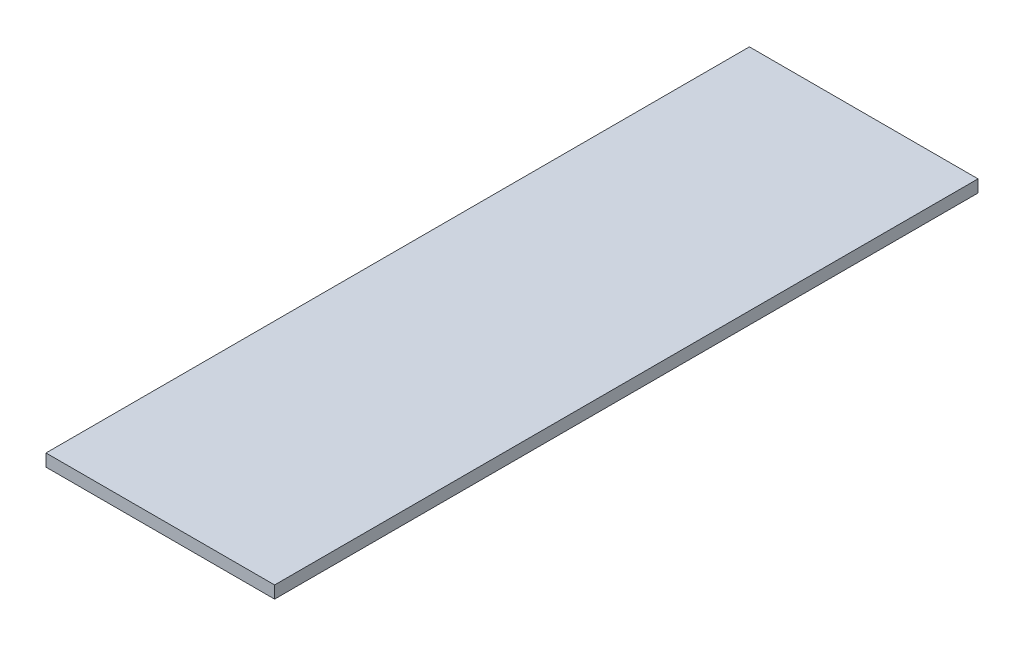
ISO-10303-21;
HEADER;
FILE_DESCRIPTION(('STEP AP214'),'2;1');
FILE_NAME('part.step','',(''),(''),'','','');
FILE_SCHEMA(('AUTOMOTIVE_DESIGN { 1 0 10303 214 1 1 1 1 }'));
ENDSEC;
DATA;
#1=APPLICATION_CONTEXT('core data for automotive mechanical design processes');
#2=APPLICATION_PROTOCOL_DEFINITION('international standard','automotive_design',2000,#1);
#3=PRODUCT_CONTEXT('',#1,'mechanical');
#4=PRODUCT('Part','Part','',(#3));
#5=PRODUCT_RELATED_PRODUCT_CATEGORY('part','',(#4));
#6=PRODUCT_DEFINITION_FORMATION('','',#4);
#7=PRODUCT_DEFINITION_CONTEXT('part definition',#1,'design');
#8=PRODUCT_DEFINITION('design','',#6,#7);
#9=PRODUCT_DEFINITION_SHAPE('','',#8);
#10=(LENGTH_UNIT() NAMED_UNIT(*) SI_UNIT(.MILLI.,.METRE.));
#11=(NAMED_UNIT(*) PLANE_ANGLE_UNIT() SI_UNIT($,.RADIAN.));
#12=(NAMED_UNIT(*) SI_UNIT($,.STERADIAN.) SOLID_ANGLE_UNIT());
#13=UNCERTAINTY_MEASURE_WITH_UNIT(LENGTH_MEASURE(1.E-05),#10,'distance_accuracy_value','');
#14=(GEOMETRIC_REPRESENTATION_CONTEXT(3) GLOBAL_UNCERTAINTY_ASSIGNED_CONTEXT((#13)) GLOBAL_UNIT_ASSIGNED_CONTEXT((#10,
#11,#12)) REPRESENTATION_CONTEXT('',''));
#15=CARTESIAN_POINT('',(0.,0.,0.));
#16=DIRECTION('',(0.,0.,1.));
#17=DIRECTION('',(1.,0.,0.));
#18=AXIS2_PLACEMENT_3D('',#15,#16,#17);
#19=CARTESIAN_POINT('',(6.50000000000001,0.7,20.));
#20=DIRECTION('',(-1.,0.,0.));
#21=DIRECTION('',(0.,0.,1.));
#22=AXIS2_PLACEMENT_3D('',#19,#20,#21);
#23=PLANE('',#22);
#24=DIRECTION('',(0.,0.,-1.));
#25=VECTOR('',#24,1.);
#26=CARTESIAN_POINT('',(6.50000000000001,0.,20.));
#27=LINE('',#26,#25);
#28=CARTESIAN_POINT('',(6.50000000000001,0.,20.));
#29=VERTEX_POINT('',#28);
#30=CARTESIAN_POINT('',(6.50000000000001,0.,-20.));
#31=VERTEX_POINT('',#30);
#32=EDGE_CURVE('E95',#29,#31,#27,.T.);
#33=ORIENTED_EDGE('',*,*,#32,.T.);
#34=DIRECTION('',(0.,-1.,0.));
#35=VECTOR('',#34,1.);
#36=CARTESIAN_POINT('',(6.50000000000001,0.7,-20.));
#37=LINE('',#36,#35);
#38=CARTESIAN_POINT('',(6.50000000000001,0.7,-20.));
#39=VERTEX_POINT('',#38);
#40=EDGE_CURVE('E11',#39,#31,#37,.T.);
#41=ORIENTED_EDGE('',*,*,#40,.F.);
#42=DIRECTION('',(0.,0.,-1.));
#43=VECTOR('',#42,1.);
#44=CARTESIAN_POINT('',(6.50000000000001,0.7,20.));
#45=LINE('',#44,#43);
#46=CARTESIAN_POINT('',(6.50000000000001,0.7,20.));
#47=VERTEX_POINT('',#46);
#48=EDGE_CURVE('E83',#47,#39,#45,.T.);
#49=ORIENTED_EDGE('',*,*,#48,.F.);
#50=DIRECTION('',(0.,-1.,0.));
#51=VECTOR('',#50,1.);
#52=CARTESIAN_POINT('',(6.50000000000001,0.7,20.));
#53=LINE('',#52,#51);
#54=EDGE_CURVE('E91',#47,#29,#53,.T.);
#55=ORIENTED_EDGE('',*,*,#54,.T.);
#56=EDGE_LOOP('',(#33,#41,#49,#55));
#57=FACE_BOUND('',#56,.T.);
#58=ADVANCED_FACE('F32',(#57),#23,.F.);
#59=CARTESIAN_POINT('',(-6.49999999999998,0.7,-20.));
#60=DIRECTION('',(0.,0.,1.));
#61=DIRECTION('',(1.,0.,0.));
#62=AXIS2_PLACEMENT_3D('',#59,#60,#61);
#63=PLANE('',#62);
#64=DIRECTION('',(-1.,0.,0.));
#65=VECTOR('',#64,1.);
#66=CARTESIAN_POINT('',(-6.49999999999998,0.,-20.));
#67=LINE('',#66,#65);
#68=CARTESIAN_POINT('',(-6.49999999999998,0.,-20.));
#69=VERTEX_POINT('',#68);
#70=EDGE_CURVE('E87',#31,#69,#67,.T.);
#71=ORIENTED_EDGE('',*,*,#70,.T.);
#72=DIRECTION('',(0.,-1.,0.));
#73=VECTOR('',#72,1.);
#74=CARTESIAN_POINT('',(-6.49999999999998,0.7,-20.));
#75=LINE('',#74,#73);
#76=CARTESIAN_POINT('',(-6.49999999999998,0.7,-20.));
#77=VERTEX_POINT('',#76);
#78=EDGE_CURVE('E40',#77,#69,#75,.T.);
#79=ORIENTED_EDGE('',*,*,#78,.F.);
#80=DIRECTION('',(-1.,0.,0.));
#81=VECTOR('',#80,1.);
#82=CARTESIAN_POINT('',(-6.49999999999998,0.7,-20.));
#83=LINE('',#82,#81);
#84=EDGE_CURVE('E78',#39,#77,#83,.T.);
#85=ORIENTED_EDGE('',*,*,#84,.F.);
#86=ORIENTED_EDGE('',*,*,#40,.T.);
#87=EDGE_LOOP('',(#71,#79,#85,#86));
#88=FACE_BOUND('',#87,.T.);
#89=ADVANCED_FACE('F86',(#88),#63,.F.);
#90=CARTESIAN_POINT('',(-6.49999999999998,0.7,20.));
#91=DIRECTION('',(1.,0.,0.));
#92=DIRECTION('',(0.,0.,-1.));
#93=AXIS2_PLACEMENT_3D('',#90,#91,#92);
#94=PLANE('',#93);
#95=DIRECTION('',(0.,0.,1.));
#96=VECTOR('',#95,1.);
#97=CARTESIAN_POINT('',(-6.49999999999998,0.,20.));
#98=LINE('',#97,#96);
#99=CARTESIAN_POINT('',(-6.49999999999998,0.,20.));
#100=VERTEX_POINT('',#99);
#101=EDGE_CURVE('E65',#69,#100,#98,.T.);
#102=ORIENTED_EDGE('',*,*,#101,.T.);
#103=DIRECTION('',(0.,-1.,0.));
#104=VECTOR('',#103,1.);
#105=CARTESIAN_POINT('',(-6.49999999999998,0.7,20.));
#106=LINE('',#105,#104);
#107=CARTESIAN_POINT('',(-6.49999999999998,0.7,20.));
#108=VERTEX_POINT('',#107);
#109=EDGE_CURVE('E88',#108,#100,#106,.T.);
#110=ORIENTED_EDGE('',*,*,#109,.F.);
#111=DIRECTION('',(0.,0.,1.));
#112=VECTOR('',#111,1.);
#113=CARTESIAN_POINT('',(-6.49999999999998,0.7,20.));
#114=LINE('',#113,#112);
#115=EDGE_CURVE('E81',#77,#108,#114,.T.);
#116=ORIENTED_EDGE('',*,*,#115,.F.);
#117=ORIENTED_EDGE('',*,*,#78,.T.);
#118=EDGE_LOOP('',(#102,#110,#116,#117));
#119=FACE_BOUND('',#118,.T.);
#120=ADVANCED_FACE('F89',(#119),#94,.F.);
#121=CARTESIAN_POINT('',(-6.49999999999998,0.7,20.));
#122=DIRECTION('',(0.,0.,-1.));
#123=DIRECTION('',(-1.,0.,0.));
#124=AXIS2_PLACEMENT_3D('',#121,#122,#123);
#125=PLANE('',#124);
#126=DIRECTION('',(1.,0.,0.));
#127=VECTOR('',#126,1.);
#128=CARTESIAN_POINT('',(-6.49999999999998,0.,20.));
#129=LINE('',#128,#127);
#130=EDGE_CURVE('E71',#100,#29,#129,.T.);
#131=ORIENTED_EDGE('',*,*,#130,.T.);
#132=ORIENTED_EDGE('',*,*,#54,.F.);
#133=DIRECTION('',(1.,0.,0.));
#134=VECTOR('',#133,1.);
#135=CARTESIAN_POINT('',(-6.49999999999998,0.7,20.));
#136=LINE('',#135,#134);
#137=EDGE_CURVE('E48',#108,#47,#136,.T.);
#138=ORIENTED_EDGE('',*,*,#137,.F.);
#139=ORIENTED_EDGE('',*,*,#109,.T.);
#140=EDGE_LOOP('',(#131,#132,#138,#139));
#141=FACE_BOUND('',#140,.T.);
#142=ADVANCED_FACE('F102',(#141),#125,.F.);
#143=CARTESIAN_POINT('',(0.,0.7,0.));
#144=DIRECTION('',(0.,-1.,0.));
#145=DIRECTION('',(0.,0.,-1.));
#146=AXIS2_PLACEMENT_3D('',#143,#144,#145);
#147=PLANE('',#146);
#148=ORIENTED_EDGE('',*,*,#48,.T.);
#149=ORIENTED_EDGE('',*,*,#84,.T.);
#150=ORIENTED_EDGE('',*,*,#115,.T.);
#151=ORIENTED_EDGE('',*,*,#137,.T.);
#152=EDGE_LOOP('',(#148,#149,#150,#151));
#153=FACE_BOUND('',#152,.T.);
#154=ADVANCED_FACE('F79',(#153),#147,.F.);
#155=CARTESIAN_POINT('',(0.,0.,0.));
#156=DIRECTION('',(0.,-1.,0.));
#157=DIRECTION('',(0.,0.,-1.));
#158=AXIS2_PLACEMENT_3D('',#155,#156,#157);
#159=PLANE('',#158);
#160=ORIENTED_EDGE('',*,*,#32,.F.);
#161=ORIENTED_EDGE('',*,*,#130,.F.);
#162=ORIENTED_EDGE('',*,*,#101,.F.);
#163=ORIENTED_EDGE('',*,*,#70,.F.);
#164=EDGE_LOOP('',(#160,#161,#162,#163));
#165=FACE_BOUND('',#164,.T.);
#166=ADVANCED_FACE('F105',(#165),#159,.T.);
#167=CLOSED_SHELL('',(#58,#89,#120,#142,#154,#166));
#168=MANIFOLD_SOLID_BREP('B2',#167);
#169=ADVANCED_BREP_SHAPE_REPRESENTATION('',(#18,#168),#14);
#170=SHAPE_DEFINITION_REPRESENTATION(#9,#169);
ENDSEC;
END-ISO-10303-21;
